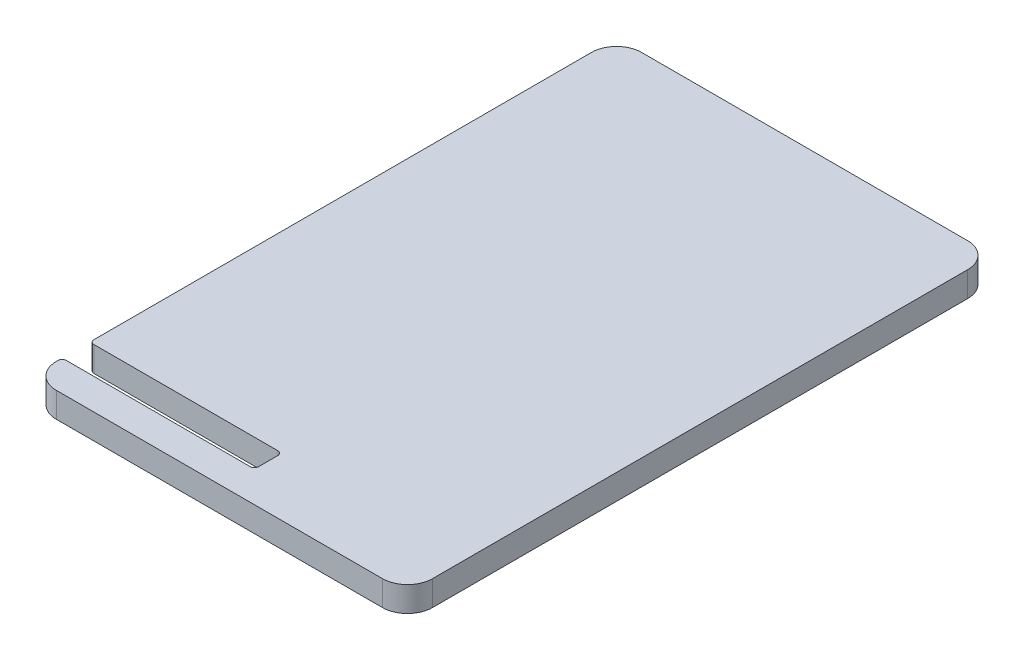
ISO-10303-21;
HEADER;
FILE_DESCRIPTION(('STEP AP214'),'2;1');
FILE_NAME('part.step','',(''),(''),'','','');
FILE_SCHEMA(('AUTOMOTIVE_DESIGN { 1 0 10303 214 1 1 1 1 }'));
ENDSEC;
DATA;
#1=APPLICATION_CONTEXT('core data for automotive mechanical design processes');
#2=APPLICATION_PROTOCOL_DEFINITION('international standard','automotive_design',2000,#1);
#3=PRODUCT_CONTEXT('',#1,'mechanical');
#4=PRODUCT('Part','Part','',(#3));
#5=PRODUCT_RELATED_PRODUCT_CATEGORY('part','',(#4));
#6=PRODUCT_DEFINITION_FORMATION('','',#4);
#7=PRODUCT_DEFINITION_CONTEXT('part definition',#1,'design');
#8=PRODUCT_DEFINITION('design','',#6,#7);
#9=PRODUCT_DEFINITION_SHAPE('','',#8);
#10=(LENGTH_UNIT() NAMED_UNIT(*) SI_UNIT(.MILLI.,.METRE.));
#11=(NAMED_UNIT(*) PLANE_ANGLE_UNIT() SI_UNIT($,.RADIAN.));
#12=(NAMED_UNIT(*) SI_UNIT($,.STERADIAN.) SOLID_ANGLE_UNIT());
#13=UNCERTAINTY_MEASURE_WITH_UNIT(LENGTH_MEASURE(1.E-05),#10,'distance_accuracy_value','');
#14=(GEOMETRIC_REPRESENTATION_CONTEXT(3) GLOBAL_UNCERTAINTY_ASSIGNED_CONTEXT((#13)) GLOBAL_UNIT_ASSIGNED_CONTEXT((#10,
#11,#12)) REPRESENTATION_CONTEXT('',''));
#15=CARTESIAN_POINT('',(0.,0.,0.));
#16=DIRECTION('',(0.,0.,1.));
#17=DIRECTION('',(1.,0.,0.));
#18=AXIS2_PLACEMENT_3D('',#15,#16,#17);
#19=CARTESIAN_POINT('',(-22.5,3.,-35.3062315740794));
#20=DIRECTION('',(1.,0.,0.));
#21=DIRECTION('',(0.,0.,-1.));
#22=AXIS2_PLACEMENT_3D('',#19,#20,#21);
#23=PLANE('',#22);
#24=DIRECTION('',(0.,0.,1.));
#25=VECTOR('',#24,1.);
#26=CARTESIAN_POINT('',(-22.5,0.,-35.3062315740794));
#27=LINE('',#26,#25);
#28=CARTESIAN_POINT('',(-22.5,0.,-32.3062315740794));
#29=VERTEX_POINT('',#28);
#30=CARTESIAN_POINT('',(-22.5,0.,27.2));
#31=VERTEX_POINT('',#30);
#32=EDGE_CURVE('E176',#29,#31,#27,.T.);
#33=ORIENTED_EDGE('',*,*,#32,.T.);
#34=DIRECTION('',(0.,1.,0.));
#35=VECTOR('',#34,1.);
#36=CARTESIAN_POINT('',(-22.5,3.,27.2));
#37=LINE('',#36,#35);
#38=CARTESIAN_POINT('',(-22.5,3.,27.2));
#39=VERTEX_POINT('',#38);
#40=EDGE_CURVE('E240',#31,#39,#37,.T.);
#41=ORIENTED_EDGE('',*,*,#40,.T.);
#42=DIRECTION('',(0.,0.,1.));
#43=VECTOR('',#42,1.);
#44=CARTESIAN_POINT('',(-22.5,3.,-35.3062315740794));
#45=LINE('',#44,#43);
#46=CARTESIAN_POINT('',(-22.5,3.,-32.3062315740794));
#47=VERTEX_POINT('',#46);
#48=EDGE_CURVE('E279',#47,#39,#45,.T.);
#49=ORIENTED_EDGE('',*,*,#48,.F.);
#50=DIRECTION('',(0.,-1.,0.));
#51=VECTOR('',#50,1.);
#52=CARTESIAN_POINT('',(-22.5,3.,-32.3062315740794));
#53=LINE('',#52,#51);
#54=EDGE_CURVE('E208',#47,#29,#53,.T.);
#55=ORIENTED_EDGE('',*,*,#54,.T.);
#56=EDGE_LOOP('',(#33,#41,#49,#55));
#57=FACE_BOUND('',#56,.T.);
#58=ADVANCED_FACE('F37',(#57),#23,.F.);
#59=CARTESIAN_POINT('',(-22.5,3.,31.5));
#60=VERTEX_POINT('',#59);
#61=CARTESIAN_POINT('',(-22.5,3.,31.6937684259206));
#62=VERTEX_POINT('',#61);
#63=EDGE_CURVE('E187',#60,#62,#45,.T.);
#64=ORIENTED_EDGE('',*,*,#63,.F.);
#65=DIRECTION('',(0.,1.,0.));
#66=VECTOR('',#65,1.);
#67=CARTESIAN_POINT('',(-22.5,3.,31.5));
#68=LINE('',#67,#66);
#69=CARTESIAN_POINT('',(-22.5,0.,31.5));
#70=VERTEX_POINT('',#69);
#71=EDGE_CURVE('E225',#60,#70,#68,.F.);
#72=ORIENTED_EDGE('',*,*,#71,.T.);
#73=CARTESIAN_POINT('',(-22.5,0.,31.6937684259206));
#74=VERTEX_POINT('',#73);
#75=EDGE_CURVE('E181',#70,#74,#27,.T.);
#76=ORIENTED_EDGE('',*,*,#75,.T.);
#77=DIRECTION('',(0.,-1.,0.));
#78=VECTOR('',#77,1.);
#79=CARTESIAN_POINT('',(-22.5,3.,31.6937684259206));
#80=LINE('',#79,#78);
#81=EDGE_CURVE('E157',#74,#62,#80,.F.);
#82=ORIENTED_EDGE('',*,*,#81,.T.);
#83=EDGE_LOOP('',(#64,#72,#76,#82));
#84=FACE_BOUND('',#83,.T.);
#85=ADVANCED_FACE('F313',(#84),#23,.F.);
#86=CARTESIAN_POINT('',(-22.5,3.,34.6937684259206));
#87=DIRECTION('',(0.,0.,-1.));
#88=DIRECTION('',(-1.,0.,0.));
#89=AXIS2_PLACEMENT_3D('',#86,#87,#88);
#90=PLANE('',#89);
#91=DIRECTION('',(1.,0.,0.));
#92=VECTOR('',#91,1.);
#93=CARTESIAN_POINT('',(-22.5,3.,34.6937684259206));
#94=LINE('',#93,#92);
#95=CARTESIAN_POINT('',(-19.5,3.,34.6937684259206));
#96=VERTEX_POINT('',#95);
#97=CARTESIAN_POINT('',(19.5,3.,34.6937684259206));
#98=VERTEX_POINT('',#97);
#99=EDGE_CURVE('E169',#96,#98,#94,.T.);
#100=ORIENTED_EDGE('',*,*,#99,.F.);
#101=DIRECTION('',(0.,-1.,0.));
#102=VECTOR('',#101,1.);
#103=CARTESIAN_POINT('',(-19.5,3.,34.6937684259206));
#104=LINE('',#103,#102);
#105=CARTESIAN_POINT('',(-19.5,0.,34.6937684259206));
#106=VERTEX_POINT('',#105);
#107=EDGE_CURVE('E155',#96,#106,#104,.T.);
#108=ORIENTED_EDGE('',*,*,#107,.T.);
#109=DIRECTION('',(1.,0.,0.));
#110=VECTOR('',#109,1.);
#111=CARTESIAN_POINT('',(-22.5,0.,34.6937684259206));
#112=LINE('',#111,#110);
#113=CARTESIAN_POINT('',(19.5,0.,34.6937684259206));
#114=VERTEX_POINT('',#113);
#115=EDGE_CURVE('E166',#106,#114,#112,.T.);
#116=ORIENTED_EDGE('',*,*,#115,.T.);
#117=DIRECTION('',(0.,-1.,0.));
#118=VECTOR('',#117,1.);
#119=CARTESIAN_POINT('',(19.5,3.,34.6937684259206));
#120=LINE('',#119,#118);
#121=EDGE_CURVE('E171',#114,#98,#120,.F.);
#122=ORIENTED_EDGE('',*,*,#121,.T.);
#123=EDGE_LOOP('',(#100,#108,#116,#122));
#124=FACE_BOUND('',#123,.T.);
#125=ADVANCED_FACE('F165',(#124),#90,.F.);
#126=CARTESIAN_POINT('',(22.5,3.,-35.3062315740794));
#127=DIRECTION('',(-1.,0.,0.));
#128=DIRECTION('',(0.,0.,1.));
#129=AXIS2_PLACEMENT_3D('',#126,#127,#128);
#130=PLANE('',#129);
#131=DIRECTION('',(0.,0.,-1.));
#132=VECTOR('',#131,1.);
#133=CARTESIAN_POINT('',(22.5,3.,-35.3062315740794));
#134=LINE('',#133,#132);
#135=CARTESIAN_POINT('',(22.5,3.,31.6937684259206));
#136=VERTEX_POINT('',#135);
#137=CARTESIAN_POINT('',(22.5,3.,-32.3062315740794));
#138=VERTEX_POINT('',#137);
#139=EDGE_CURVE('E283',#136,#138,#134,.T.);
#140=ORIENTED_EDGE('',*,*,#139,.F.);
#141=DIRECTION('',(0.,-1.,0.));
#142=VECTOR('',#141,1.);
#143=CARTESIAN_POINT('',(22.5,3.,31.6937684259206));
#144=LINE('',#143,#142);
#145=CARTESIAN_POINT('',(22.5,0.,31.6937684259206));
#146=VERTEX_POINT('',#145);
#147=EDGE_CURVE('E205',#136,#146,#144,.T.);
#148=ORIENTED_EDGE('',*,*,#147,.T.);
#149=DIRECTION('',(0.,0.,-1.));
#150=VECTOR('',#149,1.);
#151=CARTESIAN_POINT('',(22.5,0.,-35.3062315740794));
#152=LINE('',#151,#150);
#153=CARTESIAN_POINT('',(22.5,0.,-32.3062315740794));
#154=VERTEX_POINT('',#153);
#155=EDGE_CURVE('E175',#146,#154,#152,.T.);
#156=ORIENTED_EDGE('',*,*,#155,.T.);
#157=DIRECTION('',(0.,-1.,0.));
#158=VECTOR('',#157,1.);
#159=CARTESIAN_POINT('',(22.5,3.,-32.3062315740794));
#160=LINE('',#159,#158);
#161=EDGE_CURVE('E203',#154,#138,#160,.F.);
#162=ORIENTED_EDGE('',*,*,#161,.T.);
#163=EDGE_LOOP('',(#140,#148,#156,#162));
#164=FACE_BOUND('',#163,.T.);
#165=ADVANCED_FACE('F305',(#164),#130,.F.);
#166=CARTESIAN_POINT('',(-22.5,3.,-35.3062315740794));
#167=DIRECTION('',(0.,0.,1.));
#168=DIRECTION('',(1.,0.,0.));
#169=AXIS2_PLACEMENT_3D('',#166,#167,#168);
#170=PLANE('',#169);
#171=DIRECTION('',(-1.,0.,0.));
#172=VECTOR('',#171,1.);
#173=CARTESIAN_POINT('',(-22.5,0.,-35.3062315740794));
#174=LINE('',#173,#172);
#175=CARTESIAN_POINT('',(19.5,0.,-35.3062315740794));
#176=VERTEX_POINT('',#175);
#177=CARTESIAN_POINT('',(-19.5,0.,-35.3062315740794));
#178=VERTEX_POINT('',#177);
#179=EDGE_CURVE('E179',#176,#178,#174,.T.);
#180=ORIENTED_EDGE('',*,*,#179,.T.);
#181=DIRECTION('',(0.,-1.,0.));
#182=VECTOR('',#181,1.);
#183=CARTESIAN_POINT('',(-19.5,3.,-35.3062315740794));
#184=LINE('',#183,#182);
#185=CARTESIAN_POINT('',(-19.5,3.,-35.3062315740794));
#186=VERTEX_POINT('',#185);
#187=EDGE_CURVE('E214',#178,#186,#184,.F.);
#188=ORIENTED_EDGE('',*,*,#187,.T.);
#189=DIRECTION('',(-1.,0.,0.));
#190=VECTOR('',#189,1.);
#191=CARTESIAN_POINT('',(-22.5,3.,-35.3062315740794));
#192=LINE('',#191,#190);
#193=CARTESIAN_POINT('',(19.5,3.,-35.3062315740794));
#194=VERTEX_POINT('',#193);
#195=EDGE_CURVE('E188',#194,#186,#192,.T.);
#196=ORIENTED_EDGE('',*,*,#195,.F.);
#197=DIRECTION('',(0.,-1.,0.));
#198=VECTOR('',#197,1.);
#199=CARTESIAN_POINT('',(19.5,3.,-35.3062315740794));
#200=LINE('',#199,#198);
#201=EDGE_CURVE('E211',#194,#176,#200,.T.);
#202=ORIENTED_EDGE('',*,*,#201,.T.);
#203=EDGE_LOOP('',(#180,#188,#196,#202));
#204=FACE_BOUND('',#203,.T.);
#205=ADVANCED_FACE('F299',(#204),#170,.F.);
#206=CARTESIAN_POINT('',(0.,3.,0.));
#207=DIRECTION('',(0.,1.,0.));
#208=DIRECTION('',(0.,0.,1.));
#209=AXIS2_PLACEMENT_3D('',#206,#207,#208);
#210=PLANE('',#209);
#211=DIRECTION('',(1.,0.,0.));
#212=VECTOR('',#211,1.);
#213=CARTESIAN_POINT('',(-22.5,3.,31.));
#214=LINE('',#213,#212);
#215=CARTESIAN_POINT('',(-22.,3.,31.));
#216=VERTEX_POINT('',#215);
#217=CARTESIAN_POINT('',(0.,3.,31.));
#218=VERTEX_POINT('',#217);
#219=EDGE_CURVE('E262',#216,#218,#214,.T.);
#220=ORIENTED_EDGE('',*,*,#219,.F.);
#221=CARTESIAN_POINT('',(-22.,3.,31.5));
#222=DIRECTION('',(0.,1.,0.));
#223=DIRECTION('',(0.,0.,1.));
#224=AXIS2_PLACEMENT_3D('',#221,#222,#223);
#225=CIRCLE('',#224,0.5);
#226=EDGE_CURVE('E223',#216,#60,#225,.T.);
#227=ORIENTED_EDGE('',*,*,#226,.T.);
#228=ORIENTED_EDGE('',*,*,#63,.T.);
#229=CARTESIAN_POINT('',(-19.5,3.,31.6937684259206));
#230=DIRECTION('',(0.,1.,0.));
#231=DIRECTION('',(0.,0.,1.));
#232=AXIS2_PLACEMENT_3D('',#229,#230,#231);
#233=CIRCLE('',#232,3.);
#234=EDGE_CURVE('E201',#62,#96,#233,.T.);
#235=ORIENTED_EDGE('',*,*,#234,.T.);
#236=ORIENTED_EDGE('',*,*,#99,.T.);
#237=CARTESIAN_POINT('',(19.5,3.,31.6937684259206));
#238=DIRECTION('',(0.,1.,0.));
#239=DIRECTION('',(0.,0.,1.));
#240=AXIS2_PLACEMENT_3D('',#237,#238,#239);
#241=CIRCLE('',#240,3.);
#242=EDGE_CURVE('E199',#98,#136,#241,.T.);
#243=ORIENTED_EDGE('',*,*,#242,.T.);
#244=ORIENTED_EDGE('',*,*,#139,.T.);
#245=CARTESIAN_POINT('',(19.5,3.,-32.3062315740794));
#246=DIRECTION('',(0.,1.,0.));
#247=DIRECTION('',(0.,0.,1.));
#248=AXIS2_PLACEMENT_3D('',#245,#246,#247);
#249=CIRCLE('',#248,3.);
#250=EDGE_CURVE('E195',#138,#194,#249,.T.);
#251=ORIENTED_EDGE('',*,*,#250,.T.);
#252=ORIENTED_EDGE('',*,*,#195,.T.);
#253=CARTESIAN_POINT('',(-19.5,3.,-32.3062315740794));
#254=DIRECTION('',(0.,1.,0.));
#255=DIRECTION('',(0.,0.,1.));
#256=AXIS2_PLACEMENT_3D('',#253,#254,#255);
#257=CIRCLE('',#256,3.);
#258=EDGE_CURVE('E197',#186,#47,#257,.T.);
#259=ORIENTED_EDGE('',*,*,#258,.T.);
#260=ORIENTED_EDGE('',*,*,#48,.T.);
#261=CARTESIAN_POINT('',(-22.,3.,27.2));
#262=DIRECTION('',(0.,1.,0.));
#263=DIRECTION('',(0.,0.,1.));
#264=AXIS2_PLACEMENT_3D('',#261,#262,#263);
#265=CIRCLE('',#264,0.5);
#266=CARTESIAN_POINT('',(-22.,3.,27.7));
#267=VERTEX_POINT('',#266);
#268=EDGE_CURVE('E221',#39,#267,#265,.T.);
#269=ORIENTED_EDGE('',*,*,#268,.T.);
#270=DIRECTION('',(-1.,0.,0.));
#271=VECTOR('',#270,1.);
#272=CARTESIAN_POINT('',(-22.5,3.,27.7));
#273=LINE('',#272,#271);
#274=CARTESIAN_POINT('',(0.,3.,27.7));
#275=VERTEX_POINT('',#274);
#276=EDGE_CURVE('E254',#275,#267,#273,.T.);
#277=ORIENTED_EDGE('',*,*,#276,.F.);
#278=CARTESIAN_POINT('',(0.,3.,28.2));
#279=DIRECTION('',(0.,1.,0.));
#280=DIRECTION('',(0.,0.,1.));
#281=AXIS2_PLACEMENT_3D('',#278,#279,#280);
#282=CIRCLE('',#281,0.5);
#283=CARTESIAN_POINT('',(0.499999999999997,3.,28.2));
#284=VERTEX_POINT('',#283);
#285=EDGE_CURVE('E45',#275,#284,#282,.F.);
#286=ORIENTED_EDGE('',*,*,#285,.T.);
#287=DIRECTION('',(0.,0.,-1.));
#288=VECTOR('',#287,1.);
#289=CARTESIAN_POINT('',(0.499999999999997,3.,27.7));
#290=LINE('',#289,#288);
#291=CARTESIAN_POINT('',(0.499999999999997,3.,30.5));
#292=VERTEX_POINT('',#291);
#293=EDGE_CURVE('E252',#292,#284,#290,.T.);
#294=ORIENTED_EDGE('',*,*,#293,.F.);
#295=CARTESIAN_POINT('',(0.,3.,30.5));
#296=DIRECTION('',(0.,1.,0.));
#297=DIRECTION('',(0.,0.,1.));
#298=AXIS2_PLACEMENT_3D('',#295,#296,#297);
#299=CIRCLE('',#298,0.5);
#300=EDGE_CURVE('E243',#292,#218,#299,.F.);
#301=ORIENTED_EDGE('',*,*,#300,.T.);
#302=EDGE_LOOP('',(#220,#227,#228,#235,#236,#243,#244,#251,#252,#259,#260,#269,#277,#286,#294,#301));
#303=FACE_BOUND('',#302,.T.);
#304=ADVANCED_FACE('F251',(#303),#210,.T.);
#305=CARTESIAN_POINT('',(0.,0.,0.));
#306=DIRECTION('',(0.,1.,0.));
#307=DIRECTION('',(0.,0.,1.));
#308=AXIS2_PLACEMENT_3D('',#305,#306,#307);
#309=PLANE('',#308);
#310=ORIENTED_EDGE('',*,*,#75,.F.);
#311=CARTESIAN_POINT('',(-22.,0.,31.5));
#312=DIRECTION('',(0.,1.,0.));
#313=DIRECTION('',(0.,0.,1.));
#314=AXIS2_PLACEMENT_3D('',#311,#312,#313);
#315=CIRCLE('',#314,0.5);
#316=CARTESIAN_POINT('',(-22.,0.,31.));
#317=VERTEX_POINT('',#316);
#318=EDGE_CURVE('E228',#70,#317,#315,.F.);
#319=ORIENTED_EDGE('',*,*,#318,.T.);
#320=DIRECTION('',(-1.,0.,0.));
#321=VECTOR('',#320,1.);
#322=CARTESIAN_POINT('',(-22.5,0.,31.));
#323=LINE('',#322,#321);
#324=CARTESIAN_POINT('',(0.,0.,31.));
#325=VERTEX_POINT('',#324);
#326=EDGE_CURVE('E269',#325,#317,#323,.T.);
#327=ORIENTED_EDGE('',*,*,#326,.F.);
#328=CARTESIAN_POINT('',(0.,0.,30.5));
#329=DIRECTION('',(0.,1.,0.));
#330=DIRECTION('',(0.,0.,1.));
#331=AXIS2_PLACEMENT_3D('',#328,#329,#330);
#332=CIRCLE('',#331,0.5);
#333=CARTESIAN_POINT('',(0.499999999999997,0.,30.5));
#334=VERTEX_POINT('',#333);
#335=EDGE_CURVE('E245',#325,#334,#332,.T.);
#336=ORIENTED_EDGE('',*,*,#335,.T.);
#337=DIRECTION('',(0.,0.,1.));
#338=VECTOR('',#337,1.);
#339=CARTESIAN_POINT('',(0.499999999999997,0.,27.7));
#340=LINE('',#339,#338);
#341=CARTESIAN_POINT('',(0.499999999999997,0.,28.2));
#342=VERTEX_POINT('',#341);
#343=EDGE_CURVE('E270',#342,#334,#340,.T.);
#344=ORIENTED_EDGE('',*,*,#343,.F.);
#345=CARTESIAN_POINT('',(0.,0.,28.2));
#346=DIRECTION('',(0.,1.,0.));
#347=DIRECTION('',(0.,0.,1.));
#348=AXIS2_PLACEMENT_3D('',#345,#346,#347);
#349=CIRCLE('',#348,0.5);
#350=CARTESIAN_POINT('',(0.,0.,27.7));
#351=VERTEX_POINT('',#350);
#352=EDGE_CURVE('E11',#342,#351,#349,.T.);
#353=ORIENTED_EDGE('',*,*,#352,.T.);
#354=DIRECTION('',(1.,0.,0.));
#355=VECTOR('',#354,1.);
#356=CARTESIAN_POINT('',(-22.5,0.,27.7));
#357=LINE('',#356,#355);
#358=CARTESIAN_POINT('',(-22.,0.,27.7));
#359=VERTEX_POINT('',#358);
#360=EDGE_CURVE('E268',#359,#351,#357,.T.);
#361=ORIENTED_EDGE('',*,*,#360,.F.);
#362=CARTESIAN_POINT('',(-22.,0.,27.2));
#363=DIRECTION('',(0.,1.,0.));
#364=DIRECTION('',(0.,0.,1.));
#365=AXIS2_PLACEMENT_3D('',#362,#363,#364);
#366=CIRCLE('',#365,0.5);
#367=EDGE_CURVE('E52',#359,#31,#366,.F.);
#368=ORIENTED_EDGE('',*,*,#367,.T.);
#369=ORIENTED_EDGE('',*,*,#32,.F.);
#370=CARTESIAN_POINT('',(-19.5,0.,-32.3062315740794));
#371=DIRECTION('',(0.,1.,0.));
#372=DIRECTION('',(0.,0.,1.));
#373=AXIS2_PLACEMENT_3D('',#370,#371,#372);
#374=CIRCLE('',#373,3.);
#375=EDGE_CURVE('E191',#29,#178,#374,.F.);
#376=ORIENTED_EDGE('',*,*,#375,.T.);
#377=ORIENTED_EDGE('',*,*,#179,.F.);
#378=CARTESIAN_POINT('',(19.5,0.,-32.3062315740794));
#379=DIRECTION('',(0.,1.,0.));
#380=DIRECTION('',(0.,0.,1.));
#381=AXIS2_PLACEMENT_3D('',#378,#379,#380);
#382=CIRCLE('',#381,3.);
#383=EDGE_CURVE('E170',#176,#154,#382,.F.);
#384=ORIENTED_EDGE('',*,*,#383,.T.);
#385=ORIENTED_EDGE('',*,*,#155,.F.);
#386=CARTESIAN_POINT('',(19.5,0.,31.6937684259206));
#387=DIRECTION('',(0.,1.,0.));
#388=DIRECTION('',(0.,0.,1.));
#389=AXIS2_PLACEMENT_3D('',#386,#387,#388);
#390=CIRCLE('',#389,3.);
#391=EDGE_CURVE('E160',#146,#114,#390,.F.);
#392=ORIENTED_EDGE('',*,*,#391,.T.);
#393=ORIENTED_EDGE('',*,*,#115,.F.);
#394=CARTESIAN_POINT('',(-19.5,0.,31.6937684259206));
#395=DIRECTION('',(0.,1.,0.));
#396=DIRECTION('',(0.,0.,1.));
#397=AXIS2_PLACEMENT_3D('',#394,#395,#396);
#398=CIRCLE('',#397,3.);
#399=EDGE_CURVE('E151',#106,#74,#398,.F.);
#400=ORIENTED_EDGE('',*,*,#399,.T.);
#401=EDGE_LOOP('',(#310,#319,#327,#336,#344,#353,#361,#368,#369,#376,#377,#384,#385,#392,#393,#400));
#402=FACE_BOUND('',#401,.T.);
#403=ADVANCED_FACE('F173',(#402),#309,.F.);
#404=CARTESIAN_POINT('',(-22.5,-23.2355331335435,27.7));
#405=DIRECTION('',(0.,0.,-1.));
#406=DIRECTION('',(-1.,0.,0.));
#407=AXIS2_PLACEMENT_3D('',#404,#405,#406);
#408=PLANE('',#407);
#409=ORIENTED_EDGE('',*,*,#360,.T.);
#410=DIRECTION('',(0.,1.,0.));
#411=VECTOR('',#410,1.);
#412=CARTESIAN_POINT('',(0.,3.,27.7));
#413=LINE('',#412,#411);
#414=EDGE_CURVE('E237',#351,#275,#413,.T.);
#415=ORIENTED_EDGE('',*,*,#414,.T.);
#416=ORIENTED_EDGE('',*,*,#276,.T.);
#417=DIRECTION('',(0.,1.,0.));
#418=VECTOR('',#417,1.);
#419=CARTESIAN_POINT('',(-22.,-23.2355331335435,27.7));
#420=LINE('',#419,#418);
#421=EDGE_CURVE('E235',#267,#359,#420,.F.);
#422=ORIENTED_EDGE('',*,*,#421,.T.);
#423=EDGE_LOOP('',(#409,#415,#416,#422));
#424=FACE_BOUND('',#423,.T.);
#425=ADVANCED_FACE('F266',(#424),#408,.F.);
#426=CARTESIAN_POINT('',(0.499999999999997,-23.2355331335435,27.7));
#427=DIRECTION('',(1.,0.,0.));
#428=DIRECTION('',(0.,0.,-1.));
#429=AXIS2_PLACEMENT_3D('',#426,#427,#428);
#430=PLANE('',#429);
#431=ORIENTED_EDGE('',*,*,#343,.T.);
#432=DIRECTION('',(0.,1.,0.));
#433=VECTOR('',#432,1.);
#434=CARTESIAN_POINT('',(0.499999999999997,3.,30.5));
#435=LINE('',#434,#433);
#436=EDGE_CURVE('E232',#334,#292,#435,.T.);
#437=ORIENTED_EDGE('',*,*,#436,.T.);
#438=ORIENTED_EDGE('',*,*,#293,.T.);
#439=DIRECTION('',(0.,1.,0.));
#440=VECTOR('',#439,1.);
#441=CARTESIAN_POINT('',(0.499999999999997,0.,28.2));
#442=LINE('',#441,#440);
#443=EDGE_CURVE('E230',#284,#342,#442,.F.);
#444=ORIENTED_EDGE('',*,*,#443,.T.);
#445=EDGE_LOOP('',(#431,#437,#438,#444));
#446=FACE_BOUND('',#445,.T.);
#447=ADVANCED_FACE('F260',(#446),#430,.F.);
#448=CARTESIAN_POINT('',(-22.5,-23.2355331335435,31.));
#449=DIRECTION('',(0.,0.,1.));
#450=DIRECTION('',(1.,0.,0.));
#451=AXIS2_PLACEMENT_3D('',#448,#449,#450);
#452=PLANE('',#451);
#453=ORIENTED_EDGE('',*,*,#326,.T.);
#454=DIRECTION('',(0.,1.,0.));
#455=VECTOR('',#454,1.);
#456=CARTESIAN_POINT('',(-22.,-23.2355331335435,31.));
#457=LINE('',#456,#455);
#458=EDGE_CURVE('E218',#317,#216,#457,.T.);
#459=ORIENTED_EDGE('',*,*,#458,.T.);
#460=ORIENTED_EDGE('',*,*,#219,.T.);
#461=DIRECTION('',(0.,1.,0.));
#462=VECTOR('',#461,1.);
#463=CARTESIAN_POINT('',(0.,0.,31.));
#464=LINE('',#463,#462);
#465=EDGE_CURVE('E216',#218,#325,#464,.F.);
#466=ORIENTED_EDGE('',*,*,#465,.T.);
#467=EDGE_LOOP('',(#453,#459,#460,#466));
#468=FACE_BOUND('',#467,.T.);
#469=ADVANCED_FACE('F320',(#468),#452,.F.);
#470=CARTESIAN_POINT('',(-19.5,3.,31.6937684259206));
#471=DIRECTION('',(0.,-1.,0.));
#472=DIRECTION('',(0.,0.,-1.));
#473=AXIS2_PLACEMENT_3D('',#470,#471,#472);
#474=CYLINDRICAL_SURFACE('',#473,3.);
#475=ORIENTED_EDGE('',*,*,#234,.F.);
#476=ORIENTED_EDGE('',*,*,#81,.F.);
#477=ORIENTED_EDGE('',*,*,#399,.F.);
#478=ORIENTED_EDGE('',*,*,#107,.F.);
#479=EDGE_LOOP('',(#475,#476,#477,#478));
#480=FACE_BOUND('',#479,.T.);
#481=ADVANCED_FACE('F154',(#480),#474,.T.);
#482=CARTESIAN_POINT('',(19.5,3.,31.6937684259206));
#483=DIRECTION('',(0.,-1.,0.));
#484=DIRECTION('',(0.,0.,-1.));
#485=AXIS2_PLACEMENT_3D('',#482,#483,#484);
#486=CYLINDRICAL_SURFACE('',#485,3.);
#487=ORIENTED_EDGE('',*,*,#242,.F.);
#488=ORIENTED_EDGE('',*,*,#121,.F.);
#489=ORIENTED_EDGE('',*,*,#391,.F.);
#490=ORIENTED_EDGE('',*,*,#147,.F.);
#491=EDGE_LOOP('',(#487,#488,#489,#490));
#492=FACE_BOUND('',#491,.T.);
#493=ADVANCED_FACE('F309',(#492),#486,.T.);
#494=CARTESIAN_POINT('',(-19.5,3.,-32.3062315740794));
#495=DIRECTION('',(0.,-1.,0.));
#496=DIRECTION('',(0.,0.,-1.));
#497=AXIS2_PLACEMENT_3D('',#494,#495,#496);
#498=CYLINDRICAL_SURFACE('',#497,3.);
#499=ORIENTED_EDGE('',*,*,#258,.F.);
#500=ORIENTED_EDGE('',*,*,#187,.F.);
#501=ORIENTED_EDGE('',*,*,#375,.F.);
#502=ORIENTED_EDGE('',*,*,#54,.F.);
#503=EDGE_LOOP('',(#499,#500,#501,#502));
#504=FACE_BOUND('',#503,.T.);
#505=ADVANCED_FACE('F295',(#504),#498,.T.);
#506=CARTESIAN_POINT('',(19.5,3.,-32.3062315740794));
#507=DIRECTION('',(0.,-1.,0.));
#508=DIRECTION('',(0.,0.,-1.));
#509=AXIS2_PLACEMENT_3D('',#506,#507,#508);
#510=CYLINDRICAL_SURFACE('',#509,3.);
#511=ORIENTED_EDGE('',*,*,#250,.F.);
#512=ORIENTED_EDGE('',*,*,#161,.F.);
#513=ORIENTED_EDGE('',*,*,#383,.F.);
#514=ORIENTED_EDGE('',*,*,#201,.F.);
#515=EDGE_LOOP('',(#511,#512,#513,#514));
#516=FACE_BOUND('',#515,.T.);
#517=ADVANCED_FACE('F301',(#516),#510,.T.);
#518=CARTESIAN_POINT('',(-22.,-23.2355331335435,31.5));
#519=DIRECTION('',(0.,1.,0.));
#520=DIRECTION('',(0.,0.,1.));
#521=AXIS2_PLACEMENT_3D('',#518,#519,#520);
#522=CYLINDRICAL_SURFACE('',#521,0.5);
#523=ORIENTED_EDGE('',*,*,#318,.F.);
#524=ORIENTED_EDGE('',*,*,#71,.F.);
#525=ORIENTED_EDGE('',*,*,#226,.F.);
#526=ORIENTED_EDGE('',*,*,#458,.F.);
#527=EDGE_LOOP('',(#523,#524,#525,#526));
#528=FACE_BOUND('',#527,.T.);
#529=ADVANCED_FACE('F318',(#528),#522,.T.);
#530=CARTESIAN_POINT('',(0.,-23.2355331335435,30.5));
#531=DIRECTION('',(0.,-1.,0.));
#532=DIRECTION('',(0.,0.,-1.));
#533=AXIS2_PLACEMENT_3D('',#530,#531,#532);
#534=CYLINDRICAL_SURFACE('',#533,0.5);
#535=ORIENTED_EDGE('',*,*,#335,.F.);
#536=ORIENTED_EDGE('',*,*,#465,.F.);
#537=ORIENTED_EDGE('',*,*,#300,.F.);
#538=ORIENTED_EDGE('',*,*,#436,.F.);
#539=EDGE_LOOP('',(#535,#536,#537,#538));
#540=FACE_BOUND('',#539,.T.);
#541=ADVANCED_FACE('F324',(#540),#534,.F.);
#542=CARTESIAN_POINT('',(0.,-23.2355331335435,28.2));
#543=DIRECTION('',(0.,-1.,0.));
#544=DIRECTION('',(0.,0.,-1.));
#545=AXIS2_PLACEMENT_3D('',#542,#543,#544);
#546=CYLINDRICAL_SURFACE('',#545,0.5);
#547=ORIENTED_EDGE('',*,*,#352,.F.);
#548=ORIENTED_EDGE('',*,*,#443,.F.);
#549=ORIENTED_EDGE('',*,*,#285,.F.);
#550=ORIENTED_EDGE('',*,*,#414,.F.);
#551=EDGE_LOOP('',(#547,#548,#549,#550));
#552=FACE_BOUND('',#551,.T.);
#553=ADVANCED_FACE('F264',(#552),#546,.F.);
#554=CARTESIAN_POINT('',(-22.,3.,27.2));
#555=DIRECTION('',(0.,1.,0.));
#556=DIRECTION('',(0.,0.,1.));
#557=AXIS2_PLACEMENT_3D('',#554,#555,#556);
#558=CYLINDRICAL_SURFACE('',#557,0.5);
#559=ORIENTED_EDGE('',*,*,#367,.F.);
#560=ORIENTED_EDGE('',*,*,#421,.F.);
#561=ORIENTED_EDGE('',*,*,#268,.F.);
#562=ORIENTED_EDGE('',*,*,#40,.F.);
#563=EDGE_LOOP('',(#559,#560,#561,#562));
#564=FACE_BOUND('',#563,.T.);
#565=ADVANCED_FACE('F39',(#564),#558,.T.);
#566=CLOSED_SHELL('',(#58,#85,#125,#165,#205,#304,#403,#425,#447,#469,#481,#493,#505,#517,#529,
#541,#553,#565));
#567=MANIFOLD_SOLID_BREP('B2',#566);
#568=ADVANCED_BREP_SHAPE_REPRESENTATION('',(#18,#567),#14);
#569=SHAPE_DEFINITION_REPRESENTATION(#9,#568);
ENDSEC;
END-ISO-10303-21;
